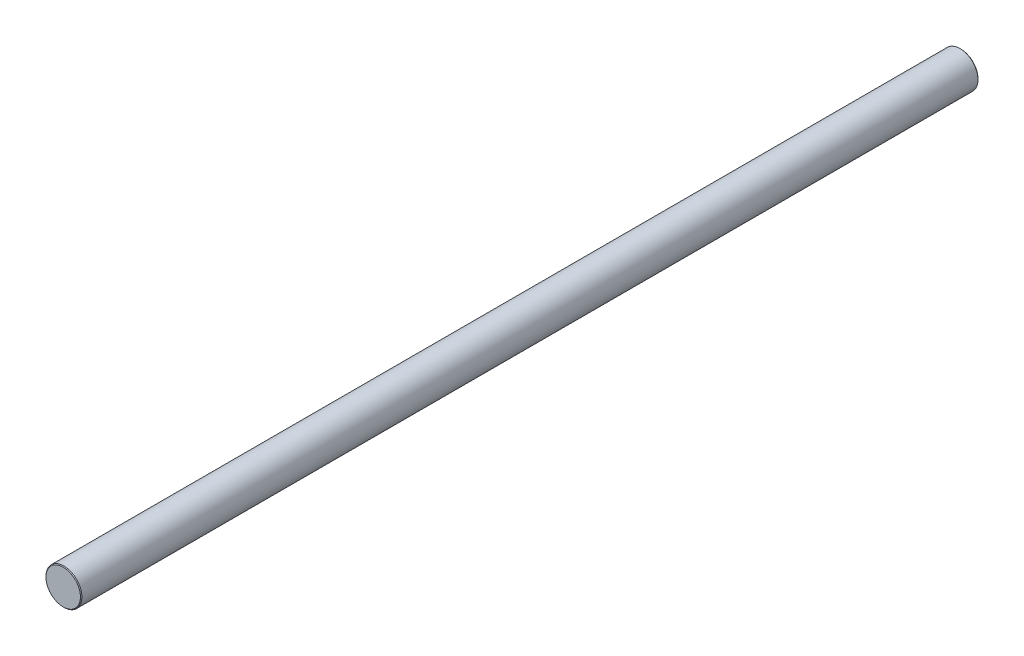
ISO-10303-21;
HEADER;
FILE_DESCRIPTION(('STEP AP214'),'2;1');
FILE_NAME('part.step','',(''),(''),'','','');
FILE_SCHEMA(('AUTOMOTIVE_DESIGN { 1 0 10303 214 1 1 1 1 }'));
ENDSEC;
DATA;
#1=APPLICATION_CONTEXT('core data for automotive mechanical design processes');
#2=APPLICATION_PROTOCOL_DEFINITION('international standard','automotive_design',2000,#1);
#3=PRODUCT_CONTEXT('',#1,'mechanical');
#4=PRODUCT('Part','Part','',(#3));
#5=PRODUCT_RELATED_PRODUCT_CATEGORY('part','',(#4));
#6=PRODUCT_DEFINITION_FORMATION('','',#4);
#7=PRODUCT_DEFINITION_CONTEXT('part definition',#1,'design');
#8=PRODUCT_DEFINITION('design','',#6,#7);
#9=PRODUCT_DEFINITION_SHAPE('','',#8);
#10=(LENGTH_UNIT() NAMED_UNIT(*) SI_UNIT(.MILLI.,.METRE.));
#11=(NAMED_UNIT(*) PLANE_ANGLE_UNIT() SI_UNIT($,.RADIAN.));
#12=(NAMED_UNIT(*) SI_UNIT($,.STERADIAN.) SOLID_ANGLE_UNIT());
#13=UNCERTAINTY_MEASURE_WITH_UNIT(LENGTH_MEASURE(1.E-05),#10,'distance_accuracy_value','');
#14=(GEOMETRIC_REPRESENTATION_CONTEXT(3) GLOBAL_UNCERTAINTY_ASSIGNED_CONTEXT((#13)) GLOBAL_UNIT_ASSIGNED_CONTEXT((#10,
#11,#12)) REPRESENTATION_CONTEXT('',''));
#15=CARTESIAN_POINT('',(0.,0.,0.));
#16=DIRECTION('',(0.,0.,1.));
#17=DIRECTION('',(1.,0.,0.));
#18=AXIS2_PLACEMENT_3D('',#15,#16,#17);
#19=CARTESIAN_POINT('',(0.,0.,250.));
#20=DIRECTION('',(0.,0.,-1.));
#21=DIRECTION('',(-1.,0.,0.));
#22=AXIS2_PLACEMENT_3D('',#19,#20,#21);
#23=CYLINDRICAL_SURFACE('',#22,5.);
#24=CARTESIAN_POINT('',(0.,0.,249.8));
#25=DIRECTION('',(0.,0.,1.));
#26=DIRECTION('',(1.,0.,0.));
#27=AXIS2_PLACEMENT_3D('',#24,#25,#26);
#28=CIRCLE('',#27,5.);
#29=CARTESIAN_POINT('',(5.,0.,249.8));
#30=VERTEX_POINT('',#29);
#31=EDGE_CURVE('E43',#30,#30,#28,.F.);
#32=ORIENTED_EDGE('',*,*,#31,.T.);
#33=EDGE_LOOP('',(#32));
#34=FACE_BOUND('',#33,.T.);
#35=CARTESIAN_POINT('',(0.,0.,0.200000000000061));
#36=DIRECTION('',(0.,0.,1.));
#37=DIRECTION('',(1.,0.,0.));
#38=AXIS2_PLACEMENT_3D('',#35,#36,#37);
#39=CIRCLE('',#38,5.);
#40=CARTESIAN_POINT('',(5.,0.,0.200000000000061));
#41=VERTEX_POINT('',#40);
#42=EDGE_CURVE('E47',#41,#41,#39,.T.);
#43=ORIENTED_EDGE('',*,*,#42,.T.);
#44=EDGE_LOOP('',(#43));
#45=FACE_BOUND('',#44,.T.);
#46=ADVANCED_FACE('F35',(#34,#45),#23,.T.);
#47=CARTESIAN_POINT('',(0.,0.,250.));
#48=DIRECTION('',(0.,0.,1.));
#49=DIRECTION('',(1.,0.,0.));
#50=AXIS2_PLACEMENT_3D('',#47,#48,#49);
#51=PLANE('',#50);
#52=CARTESIAN_POINT('',(0.,0.,250.));
#53=DIRECTION('',(0.,0.,1.));
#54=DIRECTION('',(1.,0.,0.));
#55=AXIS2_PLACEMENT_3D('',#52,#53,#54);
#56=CIRCLE('',#55,4.79999999999992);
#57=CARTESIAN_POINT('',(4.79999999999992,0.,250.));
#58=VERTEX_POINT('',#57);
#59=EDGE_CURVE('E51',#58,#58,#56,.T.);
#60=ORIENTED_EDGE('',*,*,#59,.T.);
#61=EDGE_LOOP('',(#60));
#62=FACE_BOUND('',#61,.T.);
#63=ADVANCED_FACE('F57',(#62),#51,.T.);
#64=CARTESIAN_POINT('',(0.,0.,0.));
#65=DIRECTION('',(0.,0.,1.));
#66=DIRECTION('',(1.,0.,0.));
#67=AXIS2_PLACEMENT_3D('',#64,#65,#66);
#68=PLANE('',#67);
#69=CARTESIAN_POINT('',(0.,0.,0.));
#70=DIRECTION('',(0.,0.,1.));
#71=DIRECTION('',(1.,0.,0.));
#72=AXIS2_PLACEMENT_3D('',#69,#70,#71);
#73=CIRCLE('',#72,4.79999999999997);
#74=CARTESIAN_POINT('',(4.79999999999997,0.,0.));
#75=VERTEX_POINT('',#74);
#76=EDGE_CURVE('E10',#75,#75,#73,.F.);
#77=ORIENTED_EDGE('',*,*,#76,.T.);
#78=EDGE_LOOP('',(#77));
#79=FACE_BOUND('',#78,.T.);
#80=ADVANCED_FACE('F61',(#79),#68,.F.);
#81=CARTESIAN_POINT('',(0.,0.,250.));
#82=DIRECTION('',(0.,0.,-1.));
#83=DIRECTION('',(-1.,0.,0.));
#84=AXIS2_PLACEMENT_3D('',#81,#82,#83);
#85=CONICAL_SURFACE('',#84,4.79999999999992,0.785398163397368);
#86=ORIENTED_EDGE('',*,*,#31,.F.);
#87=EDGE_LOOP('',(#86));
#88=FACE_BOUND('',#87,.T.);
#89=ORIENTED_EDGE('',*,*,#59,.F.);
#90=EDGE_LOOP('',(#89));
#91=FACE_BOUND('',#90,.T.);
#92=ADVANCED_FACE('F59',(#88,#91),#85,.T.);
#93=CARTESIAN_POINT('',(0.,0.,0.200000000000061));
#94=DIRECTION('',(0.,0.,1.));
#95=DIRECTION('',(1.,0.,0.));
#96=AXIS2_PLACEMENT_3D('',#93,#94,#95);
#97=CONICAL_SURFACE('',#96,5.,0.785398163397368);
#98=ORIENTED_EDGE('',*,*,#76,.F.);
#99=EDGE_LOOP('',(#98));
#100=FACE_BOUND('',#99,.T.);
#101=ORIENTED_EDGE('',*,*,#42,.F.);
#102=EDGE_LOOP('',(#101));
#103=FACE_BOUND('',#102,.T.);
#104=ADVANCED_FACE('F38',(#100,#103),#97,.T.);
#105=CLOSED_SHELL('',(#46,#63,#80,#92,#104));
#106=MANIFOLD_SOLID_BREP('B2',#105);
#107=ADVANCED_BREP_SHAPE_REPRESENTATION('',(#18,#106),#14);
#108=SHAPE_DEFINITION_REPRESENTATION(#9,#107);
ENDSEC;
END-ISO-10303-21;
